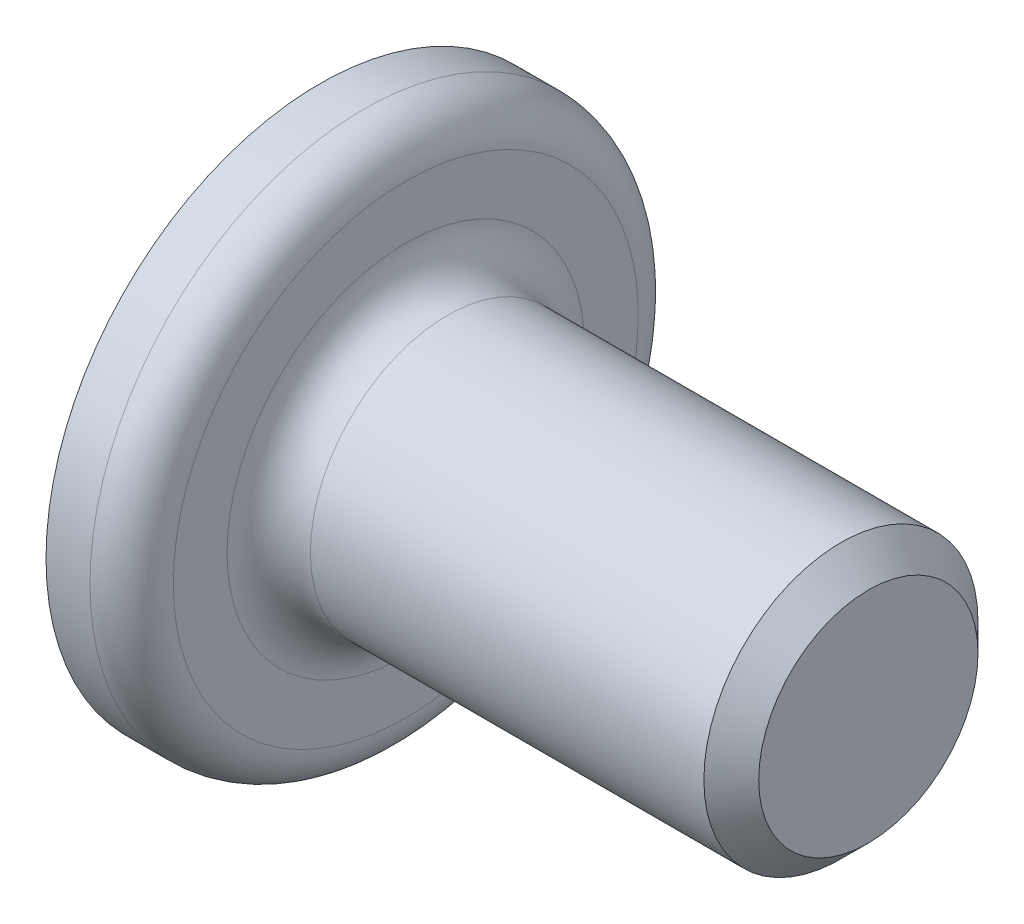
ISO-10303-21;
HEADER;
FILE_DESCRIPTION(('STEP AP214'),'2;1');
FILE_NAME('part.step','',(''),(''),'','','');
FILE_SCHEMA(('AUTOMOTIVE_DESIGN { 1 0 10303 214 1 1 1 1 }'));
ENDSEC;
DATA;
#1=APPLICATION_CONTEXT('core data for automotive mechanical design processes');
#2=APPLICATION_PROTOCOL_DEFINITION('international standard','automotive_design',2000,#1);
#3=PRODUCT_CONTEXT('',#1,'mechanical');
#4=PRODUCT('Part','Part','',(#3));
#5=PRODUCT_RELATED_PRODUCT_CATEGORY('part','',(#4));
#6=PRODUCT_DEFINITION_FORMATION('','',#4);
#7=PRODUCT_DEFINITION_CONTEXT('part definition',#1,'design');
#8=PRODUCT_DEFINITION('design','',#6,#7);
#9=PRODUCT_DEFINITION_SHAPE('','',#8);
#10=(LENGTH_UNIT() NAMED_UNIT(*) SI_UNIT(.MILLI.,.METRE.));
#11=(NAMED_UNIT(*) PLANE_ANGLE_UNIT() SI_UNIT($,.RADIAN.));
#12=(NAMED_UNIT(*) SI_UNIT($,.STERADIAN.) SOLID_ANGLE_UNIT());
#13=UNCERTAINTY_MEASURE_WITH_UNIT(LENGTH_MEASURE(1.E-05),#10,'distance_accuracy_value','');
#14=(GEOMETRIC_REPRESENTATION_CONTEXT(3) GLOBAL_UNCERTAINTY_ASSIGNED_CONTEXT((#13)) GLOBAL_UNIT_ASSIGNED_CONTEXT((#10,
#11,#12)) REPRESENTATION_CONTEXT('',''));
#15=CARTESIAN_POINT('',(0.,0.,0.));
#16=DIRECTION('',(0.,0.,1.));
#17=DIRECTION('',(1.,0.,0.));
#18=AXIS2_PLACEMENT_3D('',#15,#16,#17);
#19=CARTESIAN_POINT('',(0.,0.,0.));
#20=DIRECTION('',(1.,0.,0.));
#21=DIRECTION('',(0.,0.,-1.));
#22=AXIS2_PLACEMENT_3D('',#19,#20,#21);
#23=PLANE('',#22);
#24=CARTESIAN_POINT('',(0.,-2.38124999999996,4.12444598552341));
#25=DIRECTION('',(1.,0.,0.));
#26=DIRECTION('',(0.,0.866025403784443,0.499999999999992));
#27=AXIS2_PLACEMENT_3D('',#24,#25,#26);
#28=CIRCLE('',#27,1.2065);
#29=CARTESIAN_POINT('',(0.,-1.33639035033403,4.7276959855234));
#30=VERTEX_POINT('',#29);
#31=EDGE_CURVE('E90',#30,#30,#28,.T.);
#32=ORIENTED_EDGE('',*,*,#31,.T.);
#33=EDGE_LOOP('',(#32));
#34=FACE_BOUND('',#33,.T.);
#35=CARTESIAN_POINT('',(0.,-2.38125000000002,-4.12444598552338));
#36=DIRECTION('',(1.,0.,0.));
#37=DIRECTION('',(0.,-0.866025403784436,0.500000000000004));
#38=AXIS2_PLACEMENT_3D('',#35,#36,#37);
#39=CIRCLE('',#38,1.2065);
#40=CARTESIAN_POINT('',(0.,-3.42610964966594,-3.52119598552337));
#41=VERTEX_POINT('',#40);
#42=EDGE_CURVE('E87',#41,#41,#39,.T.);
#43=ORIENTED_EDGE('',*,*,#42,.T.);
#44=EDGE_LOOP('',(#43));
#45=FACE_BOUND('',#44,.T.);
#46=CARTESIAN_POINT('',(0.,4.7625,0.));
#47=DIRECTION('',(1.,0.,0.));
#48=DIRECTION('',(0.,0.,-1.));
#49=AXIS2_PLACEMENT_3D('',#46,#47,#48);
#50=CIRCLE('',#49,1.2065);
#51=CARTESIAN_POINT('',(0.,4.7625,-1.2065));
#52=VERTEX_POINT('',#51);
#53=EDGE_CURVE('E84',#52,#52,#50,.T.);
#54=ORIENTED_EDGE('',*,*,#53,.T.);
#55=EDGE_LOOP('',(#54));
#56=FACE_BOUND('',#55,.T.);
#57=CARTESIAN_POINT('',(0.,0.,0.));
#58=DIRECTION('',(-1.,0.,0.));
#59=DIRECTION('',(0.,0.,1.));
#60=AXIS2_PLACEMENT_3D('',#57,#58,#59);
#61=CIRCLE('',#60,6.35);
#62=CARTESIAN_POINT('',(0.,0.,6.35));
#63=VERTEX_POINT('',#62);
#64=EDGE_CURVE('E81',#63,#63,#61,.T.);
#65=ORIENTED_EDGE('',*,*,#64,.T.);
#66=EDGE_LOOP('',(#65));
#67=FACE_BOUND('',#66,.T.);
#68=ADVANCED_FACE('F55',(#34,#45,#56,#67),#23,.F.);
#69=CARTESIAN_POINT('',(0.,0.,0.));
#70=DIRECTION('',(-1.,0.,0.));
#71=DIRECTION('',(0.,0.,1.));
#72=AXIS2_PLACEMENT_3D('',#69,#70,#71);
#73=CYLINDRICAL_SURFACE('',#72,6.35);
#74=CARTESIAN_POINT('',(1.019175,0.,0.));
#75=DIRECTION('',(-1.,0.,0.));
#76=DIRECTION('',(0.,0.,1.));
#77=AXIS2_PLACEMENT_3D('',#74,#75,#76);
#78=CIRCLE('',#77,6.35);
#79=CARTESIAN_POINT('',(1.019175,0.,6.35));
#80=VERTEX_POINT('',#79);
#81=EDGE_CURVE('E70',#80,#80,#78,.T.);
#82=ORIENTED_EDGE('',*,*,#81,.T.);
#83=EDGE_LOOP('',(#82));
#84=FACE_BOUND('',#83,.T.);
#85=ORIENTED_EDGE('',*,*,#64,.F.);
#86=EDGE_LOOP('',(#85));
#87=FACE_BOUND('',#86,.T.);
#88=ADVANCED_FACE('F110',(#84,#87),#73,.T.);
#89=CARTESIAN_POINT('',(1.984375,6.35,0.));
#90=DIRECTION('',(-1.,0.,0.));
#91=DIRECTION('',(0.,0.,1.));
#92=AXIS2_PLACEMENT_3D('',#89,#90,#91);
#93=PLANE('',#92);
#94=CARTESIAN_POINT('',(1.984375,0.,0.));
#95=DIRECTION('',(-1.,0.,0.));
#96=DIRECTION('',(0.,0.,1.));
#97=AXIS2_PLACEMENT_3D('',#94,#95,#96);
#98=CIRCLE('',#97,5.3848);
#99=CARTESIAN_POINT('',(1.984375,0.,5.3848));
#100=VERTEX_POINT('',#99);
#101=EDGE_CURVE('E62',#100,#100,#98,.F.);
#102=ORIENTED_EDGE('',*,*,#101,.T.);
#103=EDGE_LOOP('',(#102));
#104=FACE_BOUND('',#103,.T.);
#105=CARTESIAN_POINT('',(1.984375,0.,0.));
#106=DIRECTION('',(-1.,0.,0.));
#107=DIRECTION('',(0.,0.,1.));
#108=AXIS2_PLACEMENT_3D('',#105,#106,#107);
#109=CIRCLE('',#108,4.1402);
#110=CARTESIAN_POINT('',(1.984375,0.,4.1402));
#111=VERTEX_POINT('',#110);
#112=EDGE_CURVE('E66',#111,#111,#109,.T.);
#113=ORIENTED_EDGE('',*,*,#112,.T.);
#114=EDGE_LOOP('',(#113));
#115=FACE_BOUND('',#114,.T.);
#116=ADVANCED_FACE('F115',(#104,#115),#93,.F.);
#117=CARTESIAN_POINT('',(0.,0.,0.));
#118=DIRECTION('',(-1.,0.,0.));
#119=DIRECTION('',(0.,0.,1.));
#120=AXIS2_PLACEMENT_3D('',#117,#118,#119);
#121=CYLINDRICAL_SURFACE('',#120,3.175);
#122=CARTESIAN_POINT('',(2.949575,0.,0.));
#123=DIRECTION('',(-1.,0.,0.));
#124=DIRECTION('',(0.,0.,1.));
#125=AXIS2_PLACEMENT_3D('',#122,#123,#124);
#126=CIRCLE('',#125,3.175);
#127=CARTESIAN_POINT('',(2.949575,0.,3.175));
#128=VERTEX_POINT('',#127);
#129=EDGE_CURVE('E11',#128,#128,#126,.F.);
#130=ORIENTED_EDGE('',*,*,#129,.T.);
#131=EDGE_LOOP('',(#130));
#132=FACE_BOUND('',#131,.T.);
#133=CARTESIAN_POINT('',(12.065,0.,0.));
#134=DIRECTION('',(-1.,0.,0.));
#135=DIRECTION('',(0.,0.,1.));
#136=AXIS2_PLACEMENT_3D('',#133,#134,#135);
#137=CIRCLE('',#136,3.175);
#138=CARTESIAN_POINT('',(12.065,0.,3.175));
#139=VERTEX_POINT('',#138);
#140=EDGE_CURVE('E78',#139,#139,#137,.T.);
#141=ORIENTED_EDGE('',*,*,#140,.T.);
#142=EDGE_LOOP('',(#141));
#143=FACE_BOUND('',#142,.T.);
#144=ADVANCED_FACE('F130',(#132,#143),#121,.T.);
#145=CARTESIAN_POINT('',(12.7,3.175,0.));
#146=DIRECTION('',(-1.,0.,0.));
#147=DIRECTION('',(0.,0.,1.));
#148=AXIS2_PLACEMENT_3D('',#145,#146,#147);
#149=PLANE('',#148);
#150=CARTESIAN_POINT('',(12.7,0.,0.));
#151=DIRECTION('',(-1.,0.,0.));
#152=DIRECTION('',(0.,0.,1.));
#153=AXIS2_PLACEMENT_3D('',#150,#151,#152);
#154=CIRCLE('',#153,2.54);
#155=CARTESIAN_POINT('',(12.7,0.,2.54));
#156=VERTEX_POINT('',#155);
#157=EDGE_CURVE('E75',#156,#156,#154,.F.);
#158=ORIENTED_EDGE('',*,*,#157,.T.);
#159=EDGE_LOOP('',(#158));
#160=FACE_BOUND('',#159,.T.);
#161=ADVANCED_FACE('F122',(#160),#149,.F.);
#162=CARTESIAN_POINT('',(12.065,0.,0.));
#163=DIRECTION('',(-1.,0.,0.));
#164=DIRECTION('',(0.,0.,1.));
#165=AXIS2_PLACEMENT_3D('',#162,#163,#164);
#166=CONICAL_SURFACE('',#165,3.175,0.78539816339745);
#167=ORIENTED_EDGE('',*,*,#157,.F.);
#168=EDGE_LOOP('',(#167));
#169=FACE_BOUND('',#168,.T.);
#170=ORIENTED_EDGE('',*,*,#140,.F.);
#171=EDGE_LOOP('',(#170));
#172=FACE_BOUND('',#171,.T.);
#173=ADVANCED_FACE('F120',(#169,#172),#166,.T.);
#174=CARTESIAN_POINT('',(0.271462499999999,4.7625,0.));
#175=DIRECTION('',(1.,0.,0.));
#176=DIRECTION('',(0.,1.,0.));
#177=AXIS2_PLACEMENT_3D('',#174,#175,#176);
#178=SPHERICAL_SURFACE('',#177,1.2366625);
#179=ORIENTED_EDGE('',*,*,#53,.F.);
#180=EDGE_LOOP('',(#179));
#181=FACE_BOUND('',#180,.T.);
#182=ADVANCED_FACE('F106',(#181),#178,.T.);
#183=CARTESIAN_POINT('',(0.271462499999999,-2.38125000000002,-4.12444598552338));
#184=DIRECTION('',(1.,0.,0.));
#185=DIRECTION('',(0.,-0.500000000000004,-0.866025403784436));
#186=AXIS2_PLACEMENT_3D('',#183,#184,#185);
#187=SPHERICAL_SURFACE('',#186,1.2366625);
#188=ORIENTED_EDGE('',*,*,#42,.F.);
#189=EDGE_LOOP('',(#188));
#190=FACE_BOUND('',#189,.T.);
#191=ADVANCED_FACE('F99',(#190),#187,.T.);
#192=CARTESIAN_POINT('',(0.271462499999999,-2.38124999999996,4.12444598552341));
#193=DIRECTION('',(1.,0.,0.));
#194=DIRECTION('',(0.,-0.499999999999992,0.866025403784443));
#195=AXIS2_PLACEMENT_3D('',#192,#193,#194);
#196=SPHERICAL_SURFACE('',#195,1.2366625);
#197=ORIENTED_EDGE('',*,*,#31,.F.);
#198=EDGE_LOOP('',(#197));
#199=FACE_BOUND('',#198,.T.);
#200=ADVANCED_FACE('F96',(#199),#196,.T.);
#201=CARTESIAN_POINT('',(1.019175,0.,0.));
#202=DIRECTION('',(-1.,0.,0.));
#203=DIRECTION('',(0.,0.,1.));
#204=AXIS2_PLACEMENT_3D('',#201,#202,#203);
#205=TOROIDAL_SURFACE('',#204,5.3848,0.9652);
#206=ORIENTED_EDGE('',*,*,#101,.F.);
#207=EDGE_LOOP('',(#206));
#208=FACE_BOUND('',#207,.T.);
#209=ORIENTED_EDGE('',*,*,#81,.F.);
#210=EDGE_LOOP('',(#209));
#211=FACE_BOUND('',#210,.T.);
#212=ADVANCED_FACE('F98',(#208,#211),#205,.T.);
#213=CARTESIAN_POINT('',(2.949575,0.,0.));
#214=DIRECTION('',(-1.,0.,0.));
#215=DIRECTION('',(0.,0.,1.));
#216=AXIS2_PLACEMENT_3D('',#213,#214,#215);
#217=TOROIDAL_SURFACE('',#216,4.1402,0.9652);
#218=ORIENTED_EDGE('',*,*,#129,.F.);
#219=EDGE_LOOP('',(#218));
#220=FACE_BOUND('',#219,.T.);
#221=ORIENTED_EDGE('',*,*,#112,.F.);
#222=EDGE_LOOP('',(#221));
#223=FACE_BOUND('',#222,.T.);
#224=ADVANCED_FACE('F57',(#220,#223),#217,.F.);
#225=CLOSED_SHELL('',(#68,#88,#116,#144,#161,#173,#182,#191,#200,#212,#224));
#226=MANIFOLD_SOLID_BREP('B2',#225);
#227=ADVANCED_BREP_SHAPE_REPRESENTATION('',(#18,#226),#14);
#228=SHAPE_DEFINITION_REPRESENTATION(#9,#227);
ENDSEC;
END-ISO-10303-21;
